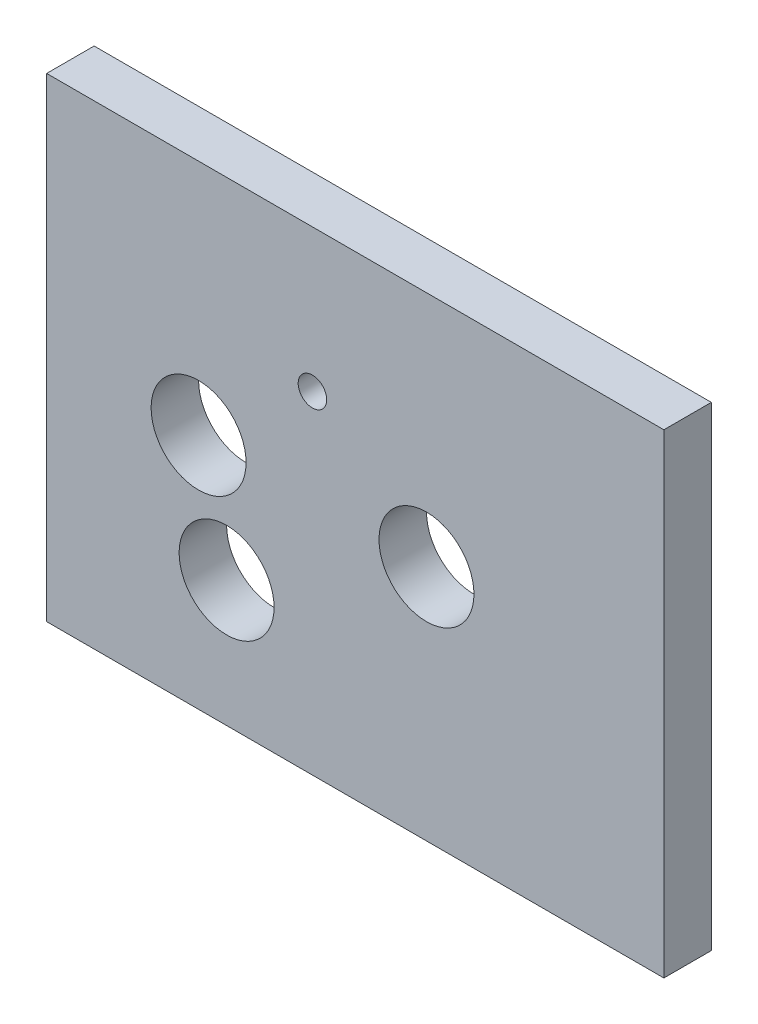
ISO-10303-21;
HEADER;
FILE_DESCRIPTION(('STEP AP214'),'2;1');
FILE_NAME('part.step','',(''),(''),'','','');
FILE_SCHEMA(('AUTOMOTIVE_DESIGN { 1 0 10303 214 1 1 1 1 }'));
ENDSEC;
DATA;
#1=APPLICATION_CONTEXT('core data for automotive mechanical design processes');
#2=APPLICATION_PROTOCOL_DEFINITION('international standard','automotive_design',2000,#1);
#3=PRODUCT_CONTEXT('',#1,'mechanical');
#4=PRODUCT('Part','Part','',(#3));
#5=PRODUCT_RELATED_PRODUCT_CATEGORY('part','',(#4));
#6=PRODUCT_DEFINITION_FORMATION('','',#4);
#7=PRODUCT_DEFINITION_CONTEXT('part definition',#1,'design');
#8=PRODUCT_DEFINITION('design','',#6,#7);
#9=PRODUCT_DEFINITION_SHAPE('','',#8);
#10=(LENGTH_UNIT() NAMED_UNIT(*) SI_UNIT(.MILLI.,.METRE.));
#11=(NAMED_UNIT(*) PLANE_ANGLE_UNIT() SI_UNIT($,.RADIAN.));
#12=(NAMED_UNIT(*) SI_UNIT($,.STERADIAN.) SOLID_ANGLE_UNIT());
#13=UNCERTAINTY_MEASURE_WITH_UNIT(LENGTH_MEASURE(1.E-05),#10,'distance_accuracy_value','');
#14=(GEOMETRIC_REPRESENTATION_CONTEXT(3) GLOBAL_UNCERTAINTY_ASSIGNED_CONTEXT((#13)) GLOBAL_UNIT_ASSIGNED_CONTEXT((#10,
#11,#12)) REPRESENTATION_CONTEXT('',''));
#15=CARTESIAN_POINT('',(0.,0.,0.));
#16=DIRECTION('',(0.,0.,1.));
#17=DIRECTION('',(1.,0.,0.));
#18=AXIS2_PLACEMENT_3D('',#15,#16,#17);
#19=CARTESIAN_POINT('',(0.,0.,5.));
#20=DIRECTION('',(1.,0.,0.));
#21=DIRECTION('',(0.,1.,0.));
#22=AXIS2_PLACEMENT_3D('',#19,#20,#21);
#23=PLANE('',#22);
#24=DIRECTION('',(0.,-1.,0.));
#25=VECTOR('',#24,1.);
#26=CARTESIAN_POINT('',(0.,0.,0.));
#27=LINE('',#26,#25);
#28=CARTESIAN_POINT('',(0.,0.,0.));
#29=VERTEX_POINT('',#28);
#30=CARTESIAN_POINT('',(0.,-50.,0.));
#31=VERTEX_POINT('',#30);
#32=EDGE_CURVE('E96',#29,#31,#27,.T.);
#33=ORIENTED_EDGE('',*,*,#32,.T.);
#34=DIRECTION('',(0.,0.,-1.));
#35=VECTOR('',#34,1.);
#36=CARTESIAN_POINT('',(0.,-50.,5.));
#37=LINE('',#36,#35);
#38=CARTESIAN_POINT('',(0.,-50.,5.));
#39=VERTEX_POINT('',#38);
#40=EDGE_CURVE('E11',#39,#31,#37,.T.);
#41=ORIENTED_EDGE('',*,*,#40,.F.);
#42=DIRECTION('',(0.,-1.,0.));
#43=VECTOR('',#42,1.);
#44=CARTESIAN_POINT('',(0.,0.,5.));
#45=LINE('',#44,#43);
#46=CARTESIAN_POINT('',(0.,0.,5.));
#47=VERTEX_POINT('',#46);
#48=EDGE_CURVE('E84',#47,#39,#45,.T.);
#49=ORIENTED_EDGE('',*,*,#48,.F.);
#50=DIRECTION('',(0.,0.,-1.));
#51=VECTOR('',#50,1.);
#52=CARTESIAN_POINT('',(0.,0.,5.));
#53=LINE('',#52,#51);
#54=EDGE_CURVE('E92',#47,#29,#53,.T.);
#55=ORIENTED_EDGE('',*,*,#54,.T.);
#56=EDGE_LOOP('',(#33,#41,#49,#55));
#57=FACE_BOUND('',#56,.T.);
#58=ADVANCED_FACE('F33',(#57),#23,.F.);
#59=CARTESIAN_POINT('',(0.,-50.,5.));
#60=DIRECTION('',(0.,1.,0.));
#61=DIRECTION('',(0.,0.,1.));
#62=AXIS2_PLACEMENT_3D('',#59,#60,#61);
#63=PLANE('',#62);
#64=DIRECTION('',(1.,0.,0.));
#65=VECTOR('',#64,1.);
#66=CARTESIAN_POINT('',(0.,-50.,0.));
#67=LINE('',#66,#65);
#68=CARTESIAN_POINT('',(65.,-50.,0.));
#69=VERTEX_POINT('',#68);
#70=EDGE_CURVE('E88',#31,#69,#67,.T.);
#71=ORIENTED_EDGE('',*,*,#70,.T.);
#72=DIRECTION('',(0.,0.,-1.));
#73=VECTOR('',#72,1.);
#74=CARTESIAN_POINT('',(65.,-50.,5.));
#75=LINE('',#74,#73);
#76=CARTESIAN_POINT('',(65.,-50.,5.));
#77=VERTEX_POINT('',#76);
#78=EDGE_CURVE('E41',#77,#69,#75,.T.);
#79=ORIENTED_EDGE('',*,*,#78,.F.);
#80=DIRECTION('',(1.,0.,0.));
#81=VECTOR('',#80,1.);
#82=CARTESIAN_POINT('',(0.,-50.,5.));
#83=LINE('',#82,#81);
#84=EDGE_CURVE('E79',#39,#77,#83,.T.);
#85=ORIENTED_EDGE('',*,*,#84,.F.);
#86=ORIENTED_EDGE('',*,*,#40,.T.);
#87=EDGE_LOOP('',(#71,#79,#85,#86));
#88=FACE_BOUND('',#87,.T.);
#89=ADVANCED_FACE('F87',(#88),#63,.F.);
#90=CARTESIAN_POINT('',(65.,0.,5.));
#91=DIRECTION('',(-1.,0.,0.));
#92=DIRECTION('',(0.,0.,1.));
#93=AXIS2_PLACEMENT_3D('',#90,#91,#92);
#94=PLANE('',#93);
#95=DIRECTION('',(0.,1.,0.));
#96=VECTOR('',#95,1.);
#97=CARTESIAN_POINT('',(65.,0.,0.));
#98=LINE('',#97,#96);
#99=CARTESIAN_POINT('',(65.,0.,0.));
#100=VERTEX_POINT('',#99);
#101=EDGE_CURVE('E66',#69,#100,#98,.T.);
#102=ORIENTED_EDGE('',*,*,#101,.T.);
#103=DIRECTION('',(0.,0.,-1.));
#104=VECTOR('',#103,1.);
#105=CARTESIAN_POINT('',(65.,0.,5.));
#106=LINE('',#105,#104);
#107=CARTESIAN_POINT('',(65.,0.,5.));
#108=VERTEX_POINT('',#107);
#109=EDGE_CURVE('E89',#108,#100,#106,.T.);
#110=ORIENTED_EDGE('',*,*,#109,.F.);
#111=DIRECTION('',(0.,1.,0.));
#112=VECTOR('',#111,1.);
#113=CARTESIAN_POINT('',(65.,0.,5.));
#114=LINE('',#113,#112);
#115=EDGE_CURVE('E82',#77,#108,#114,.T.);
#116=ORIENTED_EDGE('',*,*,#115,.F.);
#117=ORIENTED_EDGE('',*,*,#78,.T.);
#118=EDGE_LOOP('',(#102,#110,#116,#117));
#119=FACE_BOUND('',#118,.T.);
#120=ADVANCED_FACE('F90',(#119),#94,.F.);
#121=CARTESIAN_POINT('',(0.,0.,5.));
#122=DIRECTION('',(0.,-1.,0.));
#123=DIRECTION('',(0.,0.,-1.));
#124=AXIS2_PLACEMENT_3D('',#121,#122,#123);
#125=PLANE('',#124);
#126=DIRECTION('',(-1.,0.,0.));
#127=VECTOR('',#126,1.);
#128=CARTESIAN_POINT('',(0.,0.,0.));
#129=LINE('',#128,#127);
#130=EDGE_CURVE('E72',#100,#29,#129,.T.);
#131=ORIENTED_EDGE('',*,*,#130,.T.);
#132=ORIENTED_EDGE('',*,*,#54,.F.);
#133=DIRECTION('',(-1.,0.,0.));
#134=VECTOR('',#133,1.);
#135=CARTESIAN_POINT('',(0.,0.,5.));
#136=LINE('',#135,#134);
#137=EDGE_CURVE('E49',#108,#47,#136,.T.);
#138=ORIENTED_EDGE('',*,*,#137,.F.);
#139=ORIENTED_EDGE('',*,*,#109,.T.);
#140=EDGE_LOOP('',(#131,#132,#138,#139));
#141=FACE_BOUND('',#140,.T.);
#142=ADVANCED_FACE('F104',(#141),#125,.F.);
#143=CARTESIAN_POINT('',(0.,0.,5.));
#144=DIRECTION('',(0.,0.,1.));
#145=DIRECTION('',(1.,0.,0.));
#146=AXIS2_PLACEMENT_3D('',#143,#144,#145);
#147=PLANE('',#146);
#148=CARTESIAN_POINT('',(16.,-25.,5.));
#149=DIRECTION('',(0.,0.,1.));
#150=DIRECTION('',(1.,0.,0.));
#151=AXIS2_PLACEMENT_3D('',#148,#149,#150);
#152=CIRCLE('',#151,5.);
#153=CARTESIAN_POINT('',(21.,-25.,5.));
#154=VERTEX_POINT('',#153);
#155=EDGE_CURVE('E121',#154,#154,#152,.T.);
#156=ORIENTED_EDGE('',*,*,#155,.F.);
#157=EDGE_LOOP('',(#156));
#158=FACE_BOUND('',#157,.T.);
#159=CARTESIAN_POINT('',(40.,-25.,5.));
#160=DIRECTION('',(0.,0.,1.));
#161=DIRECTION('',(1.,0.,0.));
#162=AXIS2_PLACEMENT_3D('',#159,#160,#161);
#163=CIRCLE('',#162,5.);
#164=CARTESIAN_POINT('',(45.,-25.,5.));
#165=VERTEX_POINT('',#164);
#166=EDGE_CURVE('E124',#165,#165,#163,.T.);
#167=ORIENTED_EDGE('',*,*,#166,.F.);
#168=EDGE_LOOP('',(#167));
#169=FACE_BOUND('',#168,.T.);
#170=CARTESIAN_POINT('',(18.95,-36.7348838937588,5.));
#171=DIRECTION('',(0.,0.,1.));
#172=DIRECTION('',(1.,0.,0.));
#173=AXIS2_PLACEMENT_3D('',#170,#171,#172);
#174=CIRCLE('',#173,5.);
#175=CARTESIAN_POINT('',(23.95,-36.7348838937588,5.));
#176=VERTEX_POINT('',#175);
#177=EDGE_CURVE('E113',#176,#176,#174,.T.);
#178=ORIENTED_EDGE('',*,*,#177,.F.);
#179=EDGE_LOOP('',(#178));
#180=FACE_BOUND('',#179,.T.);
#181=CARTESIAN_POINT('',(27.9869916666667,-15.0164119284065,5.));
#182=DIRECTION('',(0.,0.,1.));
#183=DIRECTION('',(1.,0.,0.));
#184=AXIS2_PLACEMENT_3D('',#181,#182,#183);
#185=CIRCLE('',#184,1.5);
#186=CARTESIAN_POINT('',(29.4869916666667,-15.0164119284065,5.));
#187=VERTEX_POINT('',#186);
#188=EDGE_CURVE('E110',#187,#187,#185,.T.);
#189=ORIENTED_EDGE('',*,*,#188,.F.);
#190=EDGE_LOOP('',(#189));
#191=FACE_BOUND('',#190,.T.);
#192=ORIENTED_EDGE('',*,*,#48,.T.);
#193=ORIENTED_EDGE('',*,*,#84,.T.);
#194=ORIENTED_EDGE('',*,*,#115,.T.);
#195=ORIENTED_EDGE('',*,*,#137,.T.);
#196=EDGE_LOOP('',(#192,#193,#194,#195));
#197=FACE_BOUND('',#196,.T.);
#198=ADVANCED_FACE('F80',(#158,#169,#180,#191,#197),#147,.T.);
#199=CARTESIAN_POINT('',(0.,0.,0.));
#200=DIRECTION('',(0.,0.,1.));
#201=DIRECTION('',(1.,0.,0.));
#202=AXIS2_PLACEMENT_3D('',#199,#200,#201);
#203=PLANE('',#202);
#204=CARTESIAN_POINT('',(16.,-25.,0.));
#205=DIRECTION('',(0.,0.,-1.));
#206=DIRECTION('',(-1.,0.,0.));
#207=AXIS2_PLACEMENT_3D('',#204,#205,#206);
#208=CIRCLE('',#207,5.);
#209=CARTESIAN_POINT('',(11.,-25.,0.));
#210=VERTEX_POINT('',#209);
#211=EDGE_CURVE('E127',#210,#210,#208,.T.);
#212=ORIENTED_EDGE('',*,*,#211,.F.);
#213=EDGE_LOOP('',(#212));
#214=FACE_BOUND('',#213,.T.);
#215=CARTESIAN_POINT('',(40.,-25.,0.));
#216=DIRECTION('',(0.,0.,-1.));
#217=DIRECTION('',(-1.,0.,0.));
#218=AXIS2_PLACEMENT_3D('',#215,#216,#217);
#219=CIRCLE('',#218,5.);
#220=CARTESIAN_POINT('',(35.,-25.,0.));
#221=VERTEX_POINT('',#220);
#222=EDGE_CURVE('E128',#221,#221,#219,.T.);
#223=ORIENTED_EDGE('',*,*,#222,.F.);
#224=EDGE_LOOP('',(#223));
#225=FACE_BOUND('',#224,.T.);
#226=CARTESIAN_POINT('',(18.95,-36.7348838937588,0.));
#227=DIRECTION('',(0.,0.,-1.));
#228=DIRECTION('',(-1.,0.,0.));
#229=AXIS2_PLACEMENT_3D('',#226,#227,#228);
#230=CIRCLE('',#229,5.);
#231=CARTESIAN_POINT('',(13.95,-36.7348838937588,0.));
#232=VERTEX_POINT('',#231);
#233=EDGE_CURVE('E118',#232,#232,#230,.T.);
#234=ORIENTED_EDGE('',*,*,#233,.F.);
#235=EDGE_LOOP('',(#234));
#236=FACE_BOUND('',#235,.T.);
#237=CARTESIAN_POINT('',(27.9869916666667,-15.0164119284065,0.));
#238=DIRECTION('',(0.,0.,1.));
#239=DIRECTION('',(1.,0.,0.));
#240=AXIS2_PLACEMENT_3D('',#237,#238,#239);
#241=CIRCLE('',#240,1.5);
#242=CARTESIAN_POINT('',(29.4869916666667,-15.0164119284065,0.));
#243=VERTEX_POINT('',#242);
#244=EDGE_CURVE('E99',#243,#243,#241,.T.);
#245=ORIENTED_EDGE('',*,*,#244,.T.);
#246=EDGE_LOOP('',(#245));
#247=FACE_BOUND('',#246,.T.);
#248=ORIENTED_EDGE('',*,*,#32,.F.);
#249=ORIENTED_EDGE('',*,*,#130,.F.);
#250=ORIENTED_EDGE('',*,*,#101,.F.);
#251=ORIENTED_EDGE('',*,*,#70,.F.);
#252=EDGE_LOOP('',(#248,#249,#250,#251));
#253=FACE_BOUND('',#252,.T.);
#254=ADVANCED_FACE('F107',(#214,#225,#236,#247,#253),#203,.F.);
#255=CARTESIAN_POINT('',(27.9869916666667,-15.0164119284065,0.));
#256=DIRECTION('',(0.,0.,1.));
#257=DIRECTION('',(1.,0.,0.));
#258=AXIS2_PLACEMENT_3D('',#255,#256,#257);
#259=CYLINDRICAL_SURFACE('',#258,1.5);
#260=ORIENTED_EDGE('',*,*,#244,.F.);
#261=EDGE_LOOP('',(#260));
#262=FACE_BOUND('',#261,.T.);
#263=ORIENTED_EDGE('',*,*,#188,.T.);
#264=EDGE_LOOP('',(#263));
#265=FACE_BOUND('',#264,.T.);
#266=ADVANCED_FACE('F138',(#262,#265),#259,.F.);
#267=CARTESIAN_POINT('',(18.95,-36.7348838937588,10.));
#268=DIRECTION('',(0.,0.,-1.));
#269=DIRECTION('',(-1.,0.,0.));
#270=AXIS2_PLACEMENT_3D('',#267,#268,#269);
#271=CYLINDRICAL_SURFACE('',#270,5.);
#272=ORIENTED_EDGE('',*,*,#177,.T.);
#273=EDGE_LOOP('',(#272));
#274=FACE_BOUND('',#273,.T.);
#275=ORIENTED_EDGE('',*,*,#233,.T.);
#276=EDGE_LOOP('',(#275));
#277=FACE_BOUND('',#276,.T.);
#278=ADVANCED_FACE('F148',(#274,#277),#271,.F.);
#279=CARTESIAN_POINT('',(40.,-25.,10.));
#280=DIRECTION('',(0.,0.,-1.));
#281=DIRECTION('',(-1.,0.,0.));
#282=AXIS2_PLACEMENT_3D('',#279,#280,#281);
#283=CYLINDRICAL_SURFACE('',#282,5.);
#284=ORIENTED_EDGE('',*,*,#166,.T.);
#285=EDGE_LOOP('',(#284));
#286=FACE_BOUND('',#285,.T.);
#287=ORIENTED_EDGE('',*,*,#222,.T.);
#288=EDGE_LOOP('',(#287));
#289=FACE_BOUND('',#288,.T.);
#290=ADVANCED_FACE('F200',(#286,#289),#283,.F.);
#291=CARTESIAN_POINT('',(16.,-25.,10.));
#292=DIRECTION('',(0.,0.,-1.));
#293=DIRECTION('',(-1.,0.,0.));
#294=AXIS2_PLACEMENT_3D('',#291,#292,#293);
#295=CYLINDRICAL_SURFACE('',#294,5.);
#296=ORIENTED_EDGE('',*,*,#155,.T.);
#297=EDGE_LOOP('',(#296));
#298=FACE_BOUND('',#297,.T.);
#299=ORIENTED_EDGE('',*,*,#211,.T.);
#300=EDGE_LOOP('',(#299));
#301=FACE_BOUND('',#300,.T.);
#302=ADVANCED_FACE('F134',(#298,#301),#295,.F.);
#303=CLOSED_SHELL('',(#58,#89,#120,#142,#198,#254,#266,#278,#290,#302));
#304=MANIFOLD_SOLID_BREP('B2',#303);
#305=ADVANCED_BREP_SHAPE_REPRESENTATION('',(#18,#304),#14);
#306=SHAPE_DEFINITION_REPRESENTATION(#9,#305);
ENDSEC;
END-ISO-10303-21;
